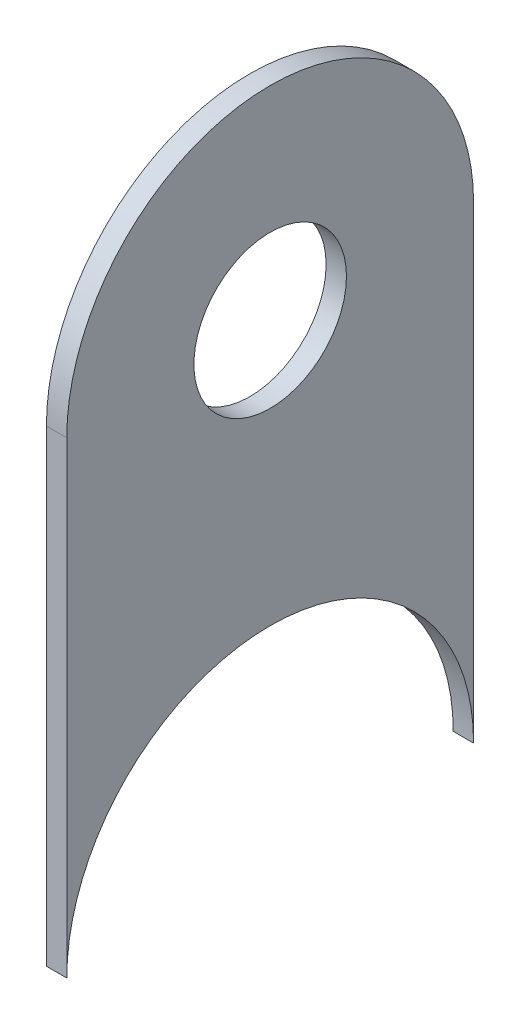
ISO-10303-21;
HEADER;
FILE_DESCRIPTION(('STEP AP214'),'2;1');
FILE_NAME('part.step','',(''),(''),'','','');
FILE_SCHEMA(('AUTOMOTIVE_DESIGN { 1 0 10303 214 1 1 1 1 }'));
ENDSEC;
DATA;
#1=APPLICATION_CONTEXT('core data for automotive mechanical design processes');
#2=APPLICATION_PROTOCOL_DEFINITION('international standard','automotive_design',2000,#1);
#3=PRODUCT_CONTEXT('',#1,'mechanical');
#4=PRODUCT('Part','Part','',(#3));
#5=PRODUCT_RELATED_PRODUCT_CATEGORY('part','',(#4));
#6=PRODUCT_DEFINITION_FORMATION('','',#4);
#7=PRODUCT_DEFINITION_CONTEXT('part definition',#1,'design');
#8=PRODUCT_DEFINITION('design','',#6,#7);
#9=PRODUCT_DEFINITION_SHAPE('','',#8);
#10=(LENGTH_UNIT() NAMED_UNIT(*) SI_UNIT(.MILLI.,.METRE.));
#11=(NAMED_UNIT(*) PLANE_ANGLE_UNIT() SI_UNIT($,.RADIAN.));
#12=(NAMED_UNIT(*) SI_UNIT($,.STERADIAN.) SOLID_ANGLE_UNIT());
#13=UNCERTAINTY_MEASURE_WITH_UNIT(LENGTH_MEASURE(1.E-05),#10,'distance_accuracy_value','');
#14=(GEOMETRIC_REPRESENTATION_CONTEXT(3) GLOBAL_UNCERTAINTY_ASSIGNED_CONTEXT((#13)) GLOBAL_UNIT_ASSIGNED_CONTEXT((#10,
#11,#12)) REPRESENTATION_CONTEXT('',''));
#15=CARTESIAN_POINT('',(0.,0.,0.));
#16=DIRECTION('',(0.,0.,1.));
#17=DIRECTION('',(1.,0.,0.));
#18=AXIS2_PLACEMENT_3D('',#15,#16,#17);
#19=CARTESIAN_POINT('',(1.27,0.,0.));
#20=DIRECTION('',(1.,0.,0.));
#21=DIRECTION('',(0.,0.,-1.));
#22=AXIS2_PLACEMENT_3D('',#19,#20,#21);
#23=PLANE('',#22);
#24=CARTESIAN_POINT('',(1.27,0.,0.));
#25=DIRECTION('',(1.,0.,0.));
#26=DIRECTION('',(0.,0.,-1.));
#27=AXIS2_PLACEMENT_3D('',#24,#25,#26);
#28=CIRCLE('',#27,12.7);
#29=CARTESIAN_POINT('',(1.27,0.,-12.7));
#30=VERTEX_POINT('',#29);
#31=CARTESIAN_POINT('',(1.27,0.,12.7));
#32=VERTEX_POINT('',#31);
#33=EDGE_CURVE('E98',#30,#32,#28,.T.);
#34=ORIENTED_EDGE('',*,*,#33,.T.);
#35=DIRECTION('',(0.,-1.,0.));
#36=VECTOR('',#35,1.);
#37=CARTESIAN_POINT('',(1.27,0.,12.7));
#38=LINE('',#37,#36);
#39=CARTESIAN_POINT('',(1.27,-29.21,12.7));
#40=VERTEX_POINT('',#39);
#41=EDGE_CURVE('E93',#32,#40,#38,.T.);
#42=ORIENTED_EDGE('',*,*,#41,.T.);
#43=CARTESIAN_POINT('',(1.27,-29.21,0.));
#44=DIRECTION('',(-1.,0.,0.));
#45=DIRECTION('',(0.,0.,-1.));
#46=AXIS2_PLACEMENT_3D('',#43,#44,#45);
#47=CIRCLE('',#46,12.7);
#48=CARTESIAN_POINT('',(1.27,-29.21,-12.7));
#49=VERTEX_POINT('',#48);
#50=EDGE_CURVE('E96',#40,#49,#47,.T.);
#51=ORIENTED_EDGE('',*,*,#50,.T.);
#52=DIRECTION('',(0.,1.,0.));
#53=VECTOR('',#52,1.);
#54=CARTESIAN_POINT('',(1.27,0.,-12.7));
#55=LINE('',#54,#53);
#56=EDGE_CURVE('E63',#49,#30,#55,.T.);
#57=ORIENTED_EDGE('',*,*,#56,.T.);
#58=EDGE_LOOP('',(#34,#42,#51,#57));
#59=FACE_BOUND('',#58,.T.);
#60=CARTESIAN_POINT('',(1.27,0.,0.));
#61=DIRECTION('',(1.,0.,0.));
#62=DIRECTION('',(0.,0.,-1.));
#63=AXIS2_PLACEMENT_3D('',#60,#61,#62);
#64=CIRCLE('',#63,4.7625);
#65=CARTESIAN_POINT('',(1.27,0.,-4.7625));
#66=VERTEX_POINT('',#65);
#67=EDGE_CURVE('E118',#66,#66,#64,.T.);
#68=ORIENTED_EDGE('',*,*,#67,.F.);
#69=EDGE_LOOP('',(#68));
#70=FACE_BOUND('',#69,.T.);
#71=ADVANCED_FACE('F45',(#59,#70),#23,.T.);
#72=CARTESIAN_POINT('',(0.,0.,0.));
#73=DIRECTION('',(1.,0.,0.));
#74=DIRECTION('',(0.,0.,-1.));
#75=AXIS2_PLACEMENT_3D('',#72,#73,#74);
#76=PLANE('',#75);
#77=CARTESIAN_POINT('',(0.,0.,0.));
#78=DIRECTION('',(1.,0.,0.));
#79=DIRECTION('',(0.,0.,-1.));
#80=AXIS2_PLACEMENT_3D('',#77,#78,#79);
#81=CIRCLE('',#80,12.7);
#82=CARTESIAN_POINT('',(0.,0.,-12.7));
#83=VERTEX_POINT('',#82);
#84=CARTESIAN_POINT('',(0.,0.,12.7));
#85=VERTEX_POINT('',#84);
#86=EDGE_CURVE('E114',#83,#85,#81,.T.);
#87=ORIENTED_EDGE('',*,*,#86,.F.);
#88=DIRECTION('',(0.,1.,0.));
#89=VECTOR('',#88,1.);
#90=CARTESIAN_POINT('',(0.,0.,-12.7));
#91=LINE('',#90,#89);
#92=CARTESIAN_POINT('',(0.,-29.21,-12.7));
#93=VERTEX_POINT('',#92);
#94=EDGE_CURVE('E86',#93,#83,#91,.T.);
#95=ORIENTED_EDGE('',*,*,#94,.F.);
#96=CARTESIAN_POINT('',(0.,-29.21,0.));
#97=DIRECTION('',(-1.,0.,0.));
#98=DIRECTION('',(0.,0.,-1.));
#99=AXIS2_PLACEMENT_3D('',#96,#97,#98);
#100=CIRCLE('',#99,12.7);
#101=CARTESIAN_POINT('',(0.,-29.21,12.7));
#102=VERTEX_POINT('',#101);
#103=EDGE_CURVE('E80',#102,#93,#100,.T.);
#104=ORIENTED_EDGE('',*,*,#103,.F.);
#105=DIRECTION('',(0.,-1.,0.));
#106=VECTOR('',#105,1.);
#107=CARTESIAN_POINT('',(0.,0.,12.7));
#108=LINE('',#107,#106);
#109=EDGE_CURVE('E103',#85,#102,#108,.T.);
#110=ORIENTED_EDGE('',*,*,#109,.F.);
#111=EDGE_LOOP('',(#87,#95,#104,#110));
#112=FACE_BOUND('',#111,.T.);
#113=CARTESIAN_POINT('',(0.,0.,0.));
#114=DIRECTION('',(1.,0.,0.));
#115=DIRECTION('',(0.,0.,-1.));
#116=AXIS2_PLACEMENT_3D('',#113,#114,#115);
#117=CIRCLE('',#116,4.7625);
#118=CARTESIAN_POINT('',(0.,0.,-4.7625));
#119=VERTEX_POINT('',#118);
#120=EDGE_CURVE('E136',#119,#119,#117,.T.);
#121=ORIENTED_EDGE('',*,*,#120,.T.);
#122=EDGE_LOOP('',(#121));
#123=FACE_BOUND('',#122,.T.);
#124=ADVANCED_FACE('F131',(#112,#123),#76,.F.);
#125=CARTESIAN_POINT('',(1.27,0.,0.));
#126=DIRECTION('',(-1.,0.,0.));
#127=DIRECTION('',(0.,0.,1.));
#128=AXIS2_PLACEMENT_3D('',#125,#126,#127);
#129=CYLINDRICAL_SURFACE('',#128,12.7);
#130=ORIENTED_EDGE('',*,*,#86,.T.);
#131=DIRECTION('',(-1.,0.,0.));
#132=VECTOR('',#131,1.);
#133=CARTESIAN_POINT('',(1.27,0.,12.7));
#134=LINE('',#133,#132);
#135=EDGE_CURVE('E11',#32,#85,#134,.T.);
#136=ORIENTED_EDGE('',*,*,#135,.F.);
#137=ORIENTED_EDGE('',*,*,#33,.F.);
#138=DIRECTION('',(-1.,0.,0.));
#139=VECTOR('',#138,1.);
#140=CARTESIAN_POINT('',(1.27,0.,-12.7));
#141=LINE('',#140,#139);
#142=EDGE_CURVE('E110',#30,#83,#141,.T.);
#143=ORIENTED_EDGE('',*,*,#142,.T.);
#144=EDGE_LOOP('',(#130,#136,#137,#143));
#145=FACE_BOUND('',#144,.T.);
#146=ADVANCED_FACE('F47',(#145),#129,.T.);
#147=CARTESIAN_POINT('',(1.27,0.,12.7));
#148=DIRECTION('',(0.,0.,-1.));
#149=DIRECTION('',(-1.,0.,0.));
#150=AXIS2_PLACEMENT_3D('',#147,#148,#149);
#151=PLANE('',#150);
#152=ORIENTED_EDGE('',*,*,#109,.T.);
#153=DIRECTION('',(-1.,0.,0.));
#154=VECTOR('',#153,1.);
#155=CARTESIAN_POINT('',(1.27,-29.21,12.7));
#156=LINE('',#155,#154);
#157=EDGE_CURVE('E55',#40,#102,#156,.T.);
#158=ORIENTED_EDGE('',*,*,#157,.F.);
#159=ORIENTED_EDGE('',*,*,#41,.F.);
#160=ORIENTED_EDGE('',*,*,#135,.T.);
#161=EDGE_LOOP('',(#152,#158,#159,#160));
#162=FACE_BOUND('',#161,.T.);
#163=ADVANCED_FACE('F102',(#162),#151,.F.);
#164=CARTESIAN_POINT('',(1.27,-29.21,0.));
#165=DIRECTION('',(-1.,0.,0.));
#166=DIRECTION('',(0.,0.,1.));
#167=AXIS2_PLACEMENT_3D('',#164,#165,#166);
#168=CYLINDRICAL_SURFACE('',#167,12.7);
#169=ORIENTED_EDGE('',*,*,#103,.T.);
#170=DIRECTION('',(-1.,0.,0.));
#171=VECTOR('',#170,1.);
#172=CARTESIAN_POINT('',(1.27,-29.21,-12.7));
#173=LINE('',#172,#171);
#174=EDGE_CURVE('E105',#49,#93,#173,.T.);
#175=ORIENTED_EDGE('',*,*,#174,.F.);
#176=ORIENTED_EDGE('',*,*,#50,.F.);
#177=ORIENTED_EDGE('',*,*,#157,.T.);
#178=EDGE_LOOP('',(#169,#175,#176,#177));
#179=FACE_BOUND('',#178,.T.);
#180=ADVANCED_FACE('F106',(#179),#168,.F.);
#181=CARTESIAN_POINT('',(1.27,0.,-12.7));
#182=DIRECTION('',(0.,0.,1.));
#183=DIRECTION('',(1.,0.,0.));
#184=AXIS2_PLACEMENT_3D('',#181,#182,#183);
#185=PLANE('',#184);
#186=ORIENTED_EDGE('',*,*,#94,.T.);
#187=ORIENTED_EDGE('',*,*,#142,.F.);
#188=ORIENTED_EDGE('',*,*,#56,.F.);
#189=ORIENTED_EDGE('',*,*,#174,.T.);
#190=EDGE_LOOP('',(#186,#187,#188,#189));
#191=FACE_BOUND('',#190,.T.);
#192=ADVANCED_FACE('F128',(#191),#185,.F.);
#193=CARTESIAN_POINT('',(1.27,0.,0.));
#194=DIRECTION('',(-1.,0.,0.));
#195=DIRECTION('',(0.,0.,1.));
#196=AXIS2_PLACEMENT_3D('',#193,#194,#195);
#197=CYLINDRICAL_SURFACE('',#196,4.7625);
#198=ORIENTED_EDGE('',*,*,#67,.T.);
#199=EDGE_LOOP('',(#198));
#200=FACE_BOUND('',#199,.T.);
#201=ORIENTED_EDGE('',*,*,#120,.F.);
#202=EDGE_LOOP('',(#201));
#203=FACE_BOUND('',#202,.T.);
#204=ADVANCED_FACE('F144',(#200,#203),#197,.F.);
#205=CLOSED_SHELL('',(#71,#124,#146,#163,#180,#192,#204));
#206=MANIFOLD_SOLID_BREP('B2',#205);
#207=ADVANCED_BREP_SHAPE_REPRESENTATION('',(#18,#206),#14);
#208=SHAPE_DEFINITION_REPRESENTATION(#9,#207);
ENDSEC;
END-ISO-10303-21;
